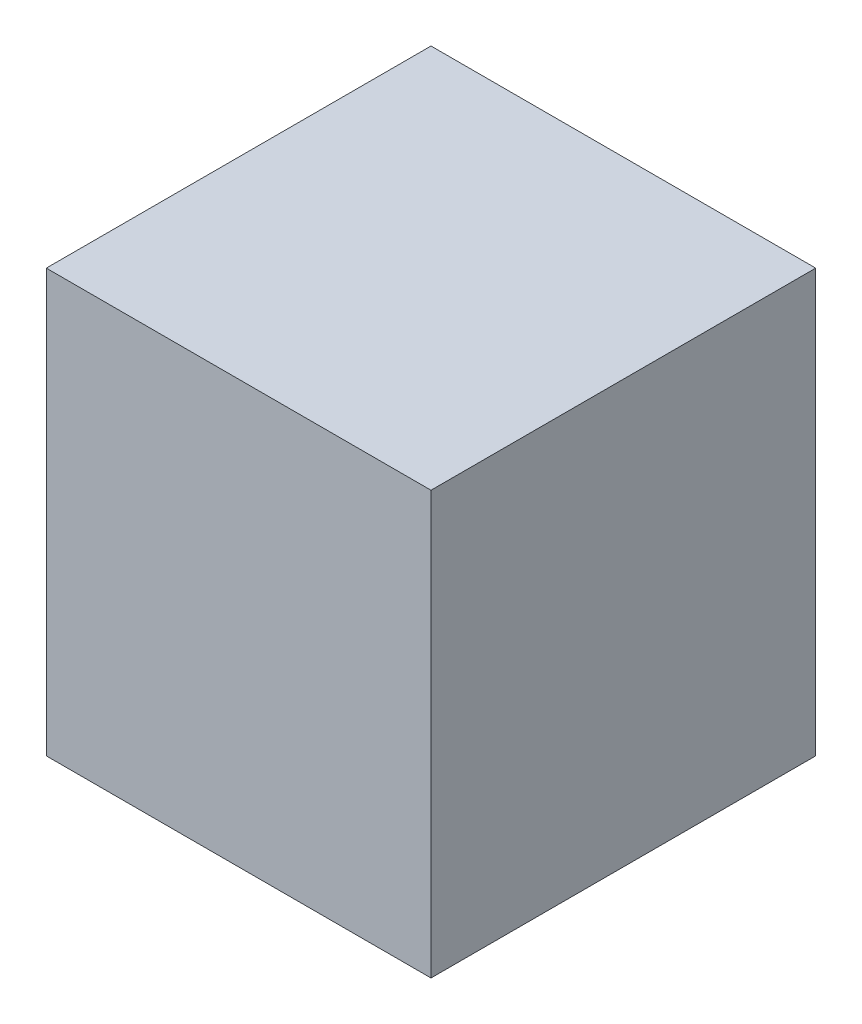
ISO-10303-21;
HEADER;
FILE_DESCRIPTION(('STEP AP214'),'2;1');
FILE_NAME('part.step','',(''),(''),'','','');
FILE_SCHEMA(('AUTOMOTIVE_DESIGN { 1 0 10303 214 1 1 1 1 }'));
ENDSEC;
DATA;
#1=APPLICATION_CONTEXT('core data for automotive mechanical design processes');
#2=APPLICATION_PROTOCOL_DEFINITION('international standard','automotive_design',2000,#1);
#3=PRODUCT_CONTEXT('',#1,'mechanical');
#4=PRODUCT('Part','Part','',(#3));
#5=PRODUCT_RELATED_PRODUCT_CATEGORY('part','',(#4));
#6=PRODUCT_DEFINITION_FORMATION('','',#4);
#7=PRODUCT_DEFINITION_CONTEXT('part definition',#1,'design');
#8=PRODUCT_DEFINITION('design','',#6,#7);
#9=PRODUCT_DEFINITION_SHAPE('','',#8);
#10=(LENGTH_UNIT() NAMED_UNIT(*) SI_UNIT(.MILLI.,.METRE.));
#11=(NAMED_UNIT(*) PLANE_ANGLE_UNIT() SI_UNIT($,.RADIAN.));
#12=(NAMED_UNIT(*) SI_UNIT($,.STERADIAN.) SOLID_ANGLE_UNIT());
#13=UNCERTAINTY_MEASURE_WITH_UNIT(LENGTH_MEASURE(1.E-05),#10,'distance_accuracy_value','');
#14=(GEOMETRIC_REPRESENTATION_CONTEXT(3) GLOBAL_UNCERTAINTY_ASSIGNED_CONTEXT((#13)) GLOBAL_UNIT_ASSIGNED_CONTEXT((#10,
#11,#12)) REPRESENTATION_CONTEXT('',''));
#15=CARTESIAN_POINT('',(0.,0.,0.));
#16=DIRECTION('',(0.,0.,1.));
#17=DIRECTION('',(1.,0.,0.));
#18=AXIS2_PLACEMENT_3D('',#15,#16,#17);
#19=CARTESIAN_POINT('',(25.5,56.,-25.5));
#20=DIRECTION('',(-1.,0.,0.));
#21=DIRECTION('',(0.,0.,1.));
#22=AXIS2_PLACEMENT_3D('',#19,#20,#21);
#23=PLANE('',#22);
#24=DIRECTION('',(0.,0.,-1.));
#25=VECTOR('',#24,1.);
#26=CARTESIAN_POINT('',(25.5,0.,-25.5));
#27=LINE('',#26,#25);
#28=CARTESIAN_POINT('',(25.5,0.,25.5));
#29=VERTEX_POINT('',#28);
#30=CARTESIAN_POINT('',(25.5,0.,-25.5));
#31=VERTEX_POINT('',#30);
#32=EDGE_CURVE('E107',#29,#31,#27,.T.);
#33=ORIENTED_EDGE('',*,*,#32,.T.);
#34=DIRECTION('',(0.,-1.,0.));
#35=VECTOR('',#34,1.);
#36=CARTESIAN_POINT('',(25.5,56.,-25.5));
#37=LINE('',#36,#35);
#38=CARTESIAN_POINT('',(25.5,56.,-25.5));
#39=VERTEX_POINT('',#38);
#40=EDGE_CURVE('E11',#39,#31,#37,.T.);
#41=ORIENTED_EDGE('',*,*,#40,.F.);
#42=DIRECTION('',(0.,0.,-1.));
#43=VECTOR('',#42,1.);
#44=CARTESIAN_POINT('',(25.5,56.,-25.5));
#45=LINE('',#44,#43);
#46=CARTESIAN_POINT('',(25.5,56.,25.5));
#47=VERTEX_POINT('',#46);
#48=EDGE_CURVE('E91',#47,#39,#45,.T.);
#49=ORIENTED_EDGE('',*,*,#48,.F.);
#50=DIRECTION('',(0.,-1.,0.));
#51=VECTOR('',#50,1.);
#52=CARTESIAN_POINT('',(25.5,56.,25.5));
#53=LINE('',#52,#51);
#54=EDGE_CURVE('E103',#47,#29,#53,.T.);
#55=ORIENTED_EDGE('',*,*,#54,.T.);
#56=EDGE_LOOP('',(#33,#41,#49,#55));
#57=FACE_BOUND('',#56,.T.);
#58=ADVANCED_FACE('F39',(#57),#23,.F.);
#59=CARTESIAN_POINT('',(-25.5,56.,-25.5));
#60=DIRECTION('',(0.,0.,1.));
#61=DIRECTION('',(1.,0.,0.));
#62=AXIS2_PLACEMENT_3D('',#59,#60,#61);
#63=PLANE('',#62);
#64=DIRECTION('',(-1.,0.,0.));
#65=VECTOR('',#64,1.);
#66=CARTESIAN_POINT('',(-25.5,0.,-25.5));
#67=LINE('',#66,#65);
#68=CARTESIAN_POINT('',(-25.5,0.,-25.5));
#69=VERTEX_POINT('',#68);
#70=EDGE_CURVE('E96',#31,#69,#67,.T.);
#71=ORIENTED_EDGE('',*,*,#70,.T.);
#72=DIRECTION('',(0.,-1.,0.));
#73=VECTOR('',#72,1.);
#74=CARTESIAN_POINT('',(-25.5,56.,-25.5));
#75=LINE('',#74,#73);
#76=CARTESIAN_POINT('',(-25.5,56.,-25.5));
#77=VERTEX_POINT('',#76);
#78=EDGE_CURVE('E48',#77,#69,#75,.T.);
#79=ORIENTED_EDGE('',*,*,#78,.F.);
#80=DIRECTION('',(-1.,0.,0.));
#81=VECTOR('',#80,1.);
#82=CARTESIAN_POINT('',(-25.5,56.,-25.5));
#83=LINE('',#82,#81);
#84=EDGE_CURVE('E86',#39,#77,#83,.T.);
#85=ORIENTED_EDGE('',*,*,#84,.F.);
#86=ORIENTED_EDGE('',*,*,#40,.T.);
#87=EDGE_LOOP('',(#71,#79,#85,#86));
#88=FACE_BOUND('',#87,.T.);
#89=ADVANCED_FACE('F95',(#88),#63,.F.);
#90=CARTESIAN_POINT('',(-25.5,56.,-25.5));
#91=DIRECTION('',(1.,0.,0.));
#92=DIRECTION('',(0.,0.,-1.));
#93=AXIS2_PLACEMENT_3D('',#90,#91,#92);
#94=PLANE('',#93);
#95=DIRECTION('',(0.,0.,1.));
#96=VECTOR('',#95,1.);
#97=CARTESIAN_POINT('',(-25.5,0.,-25.5));
#98=LINE('',#97,#96);
#99=CARTESIAN_POINT('',(-25.5,0.,25.5));
#100=VERTEX_POINT('',#99);
#101=EDGE_CURVE('E73',#69,#100,#98,.T.);
#102=ORIENTED_EDGE('',*,*,#101,.T.);
#103=DIRECTION('',(0.,-1.,0.));
#104=VECTOR('',#103,1.);
#105=CARTESIAN_POINT('',(-25.5,56.,25.5));
#106=LINE('',#105,#104);
#107=CARTESIAN_POINT('',(-25.5,56.,25.5));
#108=VERTEX_POINT('',#107);
#109=EDGE_CURVE('E98',#108,#100,#106,.T.);
#110=ORIENTED_EDGE('',*,*,#109,.F.);
#111=DIRECTION('',(0.,0.,1.));
#112=VECTOR('',#111,1.);
#113=CARTESIAN_POINT('',(-25.5,56.,-25.5));
#114=LINE('',#113,#112);
#115=EDGE_CURVE('E89',#77,#108,#114,.T.);
#116=ORIENTED_EDGE('',*,*,#115,.F.);
#117=ORIENTED_EDGE('',*,*,#78,.T.);
#118=EDGE_LOOP('',(#102,#110,#116,#117));
#119=FACE_BOUND('',#118,.T.);
#120=ADVANCED_FACE('F99',(#119),#94,.F.);
#121=CARTESIAN_POINT('',(-25.5,56.,25.5));
#122=DIRECTION('',(0.,0.,-1.));
#123=DIRECTION('',(-1.,0.,0.));
#124=AXIS2_PLACEMENT_3D('',#121,#122,#123);
#125=PLANE('',#124);
#126=DIRECTION('',(1.,0.,0.));
#127=VECTOR('',#126,1.);
#128=CARTESIAN_POINT('',(-25.5,0.,25.5));
#129=LINE('',#128,#127);
#130=EDGE_CURVE('E79',#100,#29,#129,.T.);
#131=ORIENTED_EDGE('',*,*,#130,.T.);
#132=ORIENTED_EDGE('',*,*,#54,.F.);
#133=DIRECTION('',(1.,0.,0.));
#134=VECTOR('',#133,1.);
#135=CARTESIAN_POINT('',(-25.5,56.,25.5));
#136=LINE('',#135,#134);
#137=EDGE_CURVE('E56',#108,#47,#136,.T.);
#138=ORIENTED_EDGE('',*,*,#137,.F.);
#139=ORIENTED_EDGE('',*,*,#109,.T.);
#140=EDGE_LOOP('',(#131,#132,#138,#139));
#141=FACE_BOUND('',#140,.T.);
#142=ADVANCED_FACE('F120',(#141),#125,.F.);
#143=CARTESIAN_POINT('',(0.,56.,0.));
#144=DIRECTION('',(0.,1.,0.));
#145=DIRECTION('',(0.,0.,1.));
#146=AXIS2_PLACEMENT_3D('',#143,#144,#145);
#147=PLANE('',#146);
#148=ORIENTED_EDGE('',*,*,#48,.T.);
#149=ORIENTED_EDGE('',*,*,#84,.T.);
#150=ORIENTED_EDGE('',*,*,#115,.T.);
#151=ORIENTED_EDGE('',*,*,#137,.T.);
#152=EDGE_LOOP('',(#148,#149,#150,#151));
#153=FACE_BOUND('',#152,.T.);
#154=ADVANCED_FACE('F87',(#153),#147,.T.);
#155=CARTESIAN_POINT('',(0.,0.,0.));
#156=DIRECTION('',(0.,1.,0.));
#157=DIRECTION('',(0.,0.,1.));
#158=AXIS2_PLACEMENT_3D('',#155,#156,#157);
#159=PLANE('',#158);
#160=ORIENTED_EDGE('',*,*,#32,.F.);
#161=ORIENTED_EDGE('',*,*,#130,.F.);
#162=ORIENTED_EDGE('',*,*,#101,.F.);
#163=ORIENTED_EDGE('',*,*,#70,.F.);
#164=EDGE_LOOP('',(#160,#161,#162,#163));
#165=FACE_BOUND('',#164,.T.);
#166=ADVANCED_FACE('F123',(#165),#159,.F.);
#167=CLOSED_SHELL('',(#58,#89,#120,#142,#154,#166));
#168=MANIFOLD_SOLID_BREP('B2',#167);
#169=ADVANCED_BREP_SHAPE_REPRESENTATION('',(#18,#168),#14);
#170=SHAPE_DEFINITION_REPRESENTATION(#9,#169);
ENDSEC;
END-ISO-10303-21;
